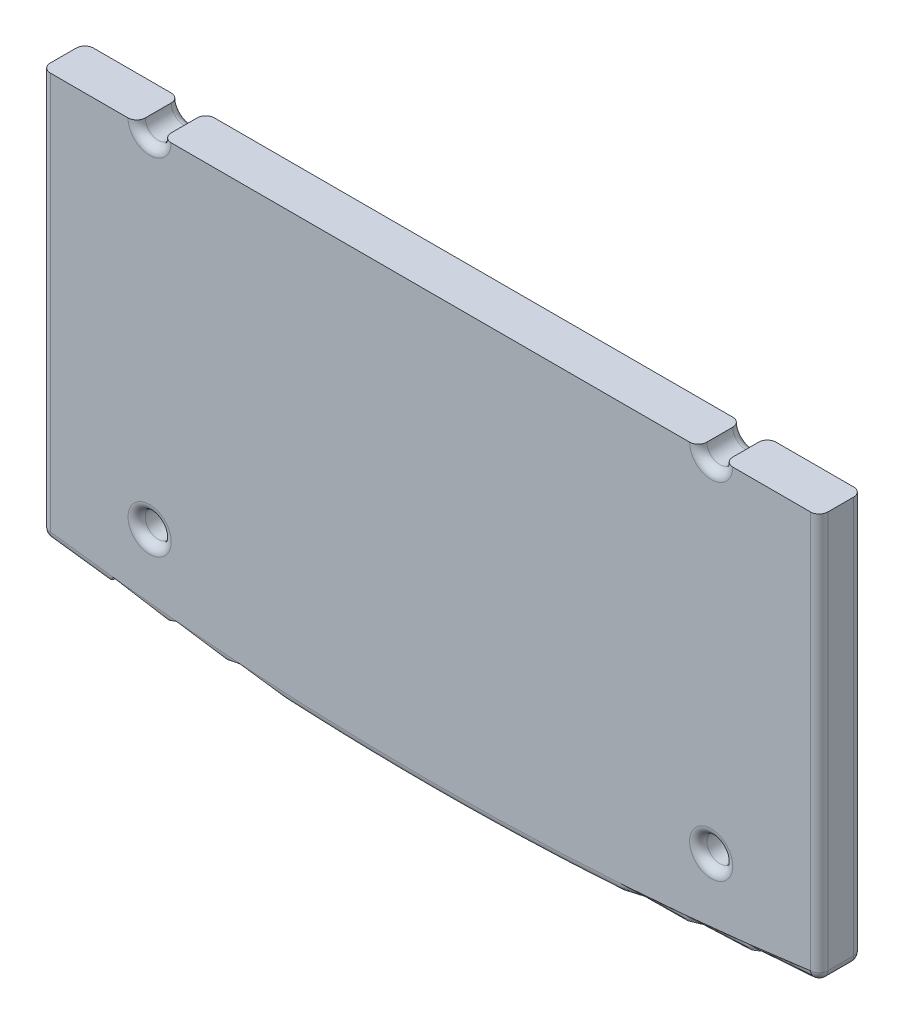
ISO-10303-21;
HEADER;
FILE_DESCRIPTION(('STEP AP214'),'2;1');
FILE_NAME('part.step','',(''),(''),'','','');
FILE_SCHEMA(('AUTOMOTIVE_DESIGN { 1 0 10303 214 1 1 1 1 }'));
ENDSEC;
DATA;
#1=APPLICATION_CONTEXT('core data for automotive mechanical design processes');
#2=APPLICATION_PROTOCOL_DEFINITION('international standard','automotive_design',2000,#1);
#3=PRODUCT_CONTEXT('',#1,'mechanical');
#4=PRODUCT('Part','Part','',(#3));
#5=PRODUCT_RELATED_PRODUCT_CATEGORY('part','',(#4));
#6=PRODUCT_DEFINITION_FORMATION('','',#4);
#7=PRODUCT_DEFINITION_CONTEXT('part definition',#1,'design');
#8=PRODUCT_DEFINITION('design','',#6,#7);
#9=PRODUCT_DEFINITION_SHAPE('','',#8);
#10=(LENGTH_UNIT() NAMED_UNIT(*) SI_UNIT(.MILLI.,.METRE.));
#11=(NAMED_UNIT(*) PLANE_ANGLE_UNIT() SI_UNIT($,.RADIAN.));
#12=(NAMED_UNIT(*) SI_UNIT($,.STERADIAN.) SOLID_ANGLE_UNIT());
#13=UNCERTAINTY_MEASURE_WITH_UNIT(LENGTH_MEASURE(1.E-05),#10,'distance_accuracy_value','');
#14=(GEOMETRIC_REPRESENTATION_CONTEXT(3) GLOBAL_UNCERTAINTY_ASSIGNED_CONTEXT((#13)) GLOBAL_UNIT_ASSIGNED_CONTEXT((#10,
#11,#12)) REPRESENTATION_CONTEXT('',''));
#15=CARTESIAN_POINT('',(0.,0.,0.));
#16=DIRECTION('',(0.,0.,1.));
#17=DIRECTION('',(1.,0.,0.));
#18=AXIS2_PLACEMENT_3D('',#15,#16,#17);
#19=CARTESIAN_POINT('',(65.,-80.,10.));
#20=DIRECTION('',(0.,0.,-1.));
#21=DIRECTION('',(-1.,0.,0.));
#22=AXIS2_PLACEMENT_3D('',#19,#20,#21);
#23=CYLINDRICAL_SURFACE('',#22,3.00000000000001);
#24=CARTESIAN_POINT('',(65.,-80.,8.));
#25=DIRECTION('',(0.,0.,1.));
#26=DIRECTION('',(1.,0.,0.));
#27=AXIS2_PLACEMENT_3D('',#24,#25,#26);
#28=CIRCLE('',#27,3.00000000000001);
#29=CARTESIAN_POINT('',(68.,-80.,8.));
#30=VERTEX_POINT('',#29);
#31=EDGE_CURVE('E288',#30,#30,#28,.T.);
#32=ORIENTED_EDGE('',*,*,#31,.T.);
#33=EDGE_LOOP('',(#32));
#34=FACE_BOUND('',#33,.T.);
#35=CARTESIAN_POINT('',(65.,-80.,2.));
#36=DIRECTION('',(0.,0.,1.));
#37=DIRECTION('',(1.,0.,0.));
#38=AXIS2_PLACEMENT_3D('',#35,#36,#37);
#39=CIRCLE('',#38,3.00000000000001);
#40=CARTESIAN_POINT('',(68.,-80.,2.));
#41=VERTEX_POINT('',#40);
#42=EDGE_CURVE('E284',#41,#41,#39,.F.);
#43=ORIENTED_EDGE('',*,*,#42,.T.);
#44=EDGE_LOOP('',(#43));
#45=FACE_BOUND('',#44,.T.);
#46=ADVANCED_FACE('F43',(#34,#45),#23,.F.);
#47=CARTESIAN_POINT('',(-65.,-80.,10.));
#48=DIRECTION('',(0.,0.,-1.));
#49=DIRECTION('',(-1.,0.,0.));
#50=AXIS2_PLACEMENT_3D('',#47,#48,#49);
#51=CYLINDRICAL_SURFACE('',#50,3.00000000000001);
#52=CARTESIAN_POINT('',(-65.,-80.,8.));
#53=DIRECTION('',(0.,0.,1.));
#54=DIRECTION('',(1.,0.,0.));
#55=AXIS2_PLACEMENT_3D('',#52,#53,#54);
#56=CIRCLE('',#55,3.00000000000001);
#57=CARTESIAN_POINT('',(-62.,-80.,8.));
#58=VERTEX_POINT('',#57);
#59=EDGE_CURVE('E318',#58,#58,#56,.T.);
#60=ORIENTED_EDGE('',*,*,#59,.T.);
#61=EDGE_LOOP('',(#60));
#62=FACE_BOUND('',#61,.T.);
#63=CARTESIAN_POINT('',(-65.,-80.,2.));
#64=DIRECTION('',(0.,0.,1.));
#65=DIRECTION('',(1.,0.,0.));
#66=AXIS2_PLACEMENT_3D('',#63,#64,#65);
#67=CIRCLE('',#66,3.00000000000001);
#68=CARTESIAN_POINT('',(-62.,-80.,2.));
#69=VERTEX_POINT('',#68);
#70=EDGE_CURVE('E315',#69,#69,#67,.F.);
#71=ORIENTED_EDGE('',*,*,#70,.T.);
#72=EDGE_LOOP('',(#71));
#73=FACE_BOUND('',#72,.T.);
#74=ADVANCED_FACE('F389',(#62,#73),#51,.F.);
#75=CARTESIAN_POINT('',(90.,0.,10.));
#76=DIRECTION('',(1.,0.,0.));
#77=DIRECTION('',(0.,1.,0.));
#78=AXIS2_PLACEMENT_3D('',#75,#76,#77);
#79=PLANE('',#78);
#80=DIRECTION('',(0.,0.,-1.));
#81=VECTOR('',#80,1.);
#82=CARTESIAN_POINT('',(90.,0.,10.));
#83=LINE('',#82,#81);
#84=CARTESIAN_POINT('',(90.,0.,8.));
#85=VERTEX_POINT('',#84);
#86=CARTESIAN_POINT('',(90.,0.,2.));
#87=VERTEX_POINT('',#86);
#88=EDGE_CURVE('E337',#85,#87,#83,.T.);
#89=ORIENTED_EDGE('',*,*,#88,.F.);
#90=DIRECTION('',(0.,-1.,0.));
#91=VECTOR('',#90,1.);
#92=CARTESIAN_POINT('',(90.,0.,8.));
#93=LINE('',#92,#91);
#94=CARTESIAN_POINT('',(90.,-91.9885850637983,8.));
#95=VERTEX_POINT('',#94);
#96=EDGE_CURVE('E253',#85,#95,#93,.T.);
#97=ORIENTED_EDGE('',*,*,#96,.T.);
#98=DIRECTION('',(0.,0.,-1.));
#99=VECTOR('',#98,1.);
#100=CARTESIAN_POINT('',(90.,-91.9885850637983,10.));
#101=LINE('',#100,#99);
#102=CARTESIAN_POINT('',(90.,-91.9885850637983,2.));
#103=VERTEX_POINT('',#102);
#104=EDGE_CURVE('E249',#95,#103,#101,.T.);
#105=ORIENTED_EDGE('',*,*,#104,.T.);
#106=DIRECTION('',(0.,-1.,0.));
#107=VECTOR('',#106,1.);
#108=CARTESIAN_POINT('',(90.,86.269555063544,2.));
#109=LINE('',#108,#107);
#110=EDGE_CURVE('E264',#103,#87,#109,.F.);
#111=ORIENTED_EDGE('',*,*,#110,.T.);
#112=EDGE_LOOP('',(#89,#97,#105,#111));
#113=FACE_BOUND('',#112,.T.);
#114=ADVANCED_FACE('F336',(#113),#79,.T.);
#115=CARTESIAN_POINT('',(-90.,0.,10.));
#116=DIRECTION('',(1.,0.,0.));
#117=DIRECTION('',(0.,1.,0.));
#118=AXIS2_PLACEMENT_3D('',#115,#116,#117);
#119=PLANE('',#118);
#120=DIRECTION('',(0.,-1.,0.));
#121=VECTOR('',#120,1.);
#122=CARTESIAN_POINT('',(-90.,86.2695550635439,8.));
#123=LINE('',#122,#121);
#124=CARTESIAN_POINT('',(-90.,-91.9885850637981,8.));
#125=VERTEX_POINT('',#124);
#126=CARTESIAN_POINT('',(-90.,0.,8.));
#127=VERTEX_POINT('',#126);
#128=EDGE_CURVE('E285',#125,#127,#123,.F.);
#129=ORIENTED_EDGE('',*,*,#128,.T.);
#130=DIRECTION('',(0.,0.,-1.));
#131=VECTOR('',#130,1.);
#132=CARTESIAN_POINT('',(-90.,0.,10.));
#133=LINE('',#132,#131);
#134=CARTESIAN_POINT('',(-90.,0.,2.));
#135=VERTEX_POINT('',#134);
#136=EDGE_CURVE('E186',#127,#135,#133,.T.);
#137=ORIENTED_EDGE('',*,*,#136,.T.);
#138=DIRECTION('',(0.,-1.,0.));
#139=VECTOR('',#138,1.);
#140=CARTESIAN_POINT('',(-90.,0.,2.));
#141=LINE('',#140,#139);
#142=CARTESIAN_POINT('',(-90.,-91.9885850637981,2.));
#143=VERTEX_POINT('',#142);
#144=EDGE_CURVE('E185',#135,#143,#141,.T.);
#145=ORIENTED_EDGE('',*,*,#144,.T.);
#146=DIRECTION('',(0.,0.,1.));
#147=VECTOR('',#146,1.);
#148=CARTESIAN_POINT('',(-90.,-91.9885850637981,10.));
#149=LINE('',#148,#147);
#150=EDGE_CURVE('E278',#143,#125,#149,.T.);
#151=ORIENTED_EDGE('',*,*,#150,.T.);
#152=EDGE_LOOP('',(#129,#137,#145,#151));
#153=FACE_BOUND('',#152,.T.);
#154=ADVANCED_FACE('F363',(#153),#119,.F.);
#155=CARTESIAN_POINT('',(0.,549.113632323209,10.));
#156=DIRECTION('',(0.,0.,-1.));
#157=DIRECTION('',(-1.,0.,0.));
#158=AXIS2_PLACEMENT_3D('',#155,#156,#157);
#159=CYLINDRICAL_SURFACE('',#158,649.113632323209);
#160=CARTESIAN_POINT('',(0.,549.113632323209,8.));
#161=DIRECTION('',(0.,0.,1.));
#162=DIRECTION('',(1.,0.,0.));
#163=AXIS2_PLACEMENT_3D('',#160,#161,#162);
#164=CIRCLE('',#163,649.113632323209);
#165=CARTESIAN_POINT('',(88.2719769623275,-93.9700059004614,8.));
#166=VERTEX_POINT('',#165);
#167=CARTESIAN_POINT('',(-88.2719769623275,-93.9700059004614,8.));
#168=VERTEX_POINT('',#167);
#169=EDGE_CURVE('E354',#166,#168,#164,.F.);
#170=ORIENTED_EDGE('',*,*,#169,.T.);
#171=DIRECTION('',(0.,0.,-1.));
#172=VECTOR('',#171,1.);
#173=CARTESIAN_POINT('',(-88.2719769623275,-93.9700059004616,10.));
#174=LINE('',#173,#172);
#175=CARTESIAN_POINT('',(-88.2719769623275,-93.9700059004614,2.));
#176=VERTEX_POINT('',#175);
#177=EDGE_CURVE('E357',#168,#176,#174,.T.);
#178=ORIENTED_EDGE('',*,*,#177,.T.);
#179=CARTESIAN_POINT('',(0.,549.113632323209,2.));
#180=DIRECTION('',(0.,0.,1.));
#181=DIRECTION('',(1.,0.,0.));
#182=AXIS2_PLACEMENT_3D('',#179,#180,#181);
#183=CIRCLE('',#182,649.113632323209);
#184=CARTESIAN_POINT('',(88.2719769623275,-93.9700059004614,2.));
#185=VERTEX_POINT('',#184);
#186=EDGE_CURVE('E235',#176,#185,#183,.T.);
#187=ORIENTED_EDGE('',*,*,#186,.T.);
#188=DIRECTION('',(0.,0.,-1.));
#189=VECTOR('',#188,1.);
#190=CARTESIAN_POINT('',(88.2719769623276,-93.9700059004616,10.));
#191=LINE('',#190,#189);
#192=EDGE_CURVE('E358',#185,#166,#191,.F.);
#193=ORIENTED_EDGE('',*,*,#192,.T.);
#194=EDGE_LOOP('',(#170,#178,#187,#193));
#195=FACE_BOUND('',#194,.T.);
#196=ADVANCED_FACE('F374',(#195),#159,.T.);
#197=CARTESIAN_POINT('',(0.,0.,10.));
#198=DIRECTION('',(0.,0.,1.));
#199=DIRECTION('',(1.,0.,0.));
#200=AXIS2_PLACEMENT_3D('',#197,#198,#199);
#201=PLANE('',#200);
#202=DIRECTION('',(1.,0.,0.));
#203=VECTOR('',#202,1.);
#204=CARTESIAN_POINT('',(-102.315032388531,0.,10.));
#205=LINE('',#204,#203);
#206=CARTESIAN_POINT('',(-88.,0.,10.));
#207=VERTEX_POINT('',#206);
#208=CARTESIAN_POINT('',(-70.,0.,10.));
#209=VERTEX_POINT('',#208);
#210=EDGE_CURVE('E477',#207,#209,#205,.T.);
#211=ORIENTED_EDGE('',*,*,#210,.F.);
#212=DIRECTION('',(0.,-1.,0.));
#213=VECTOR('',#212,1.);
#214=CARTESIAN_POINT('',(-88.,-93.7304449364561,10.));
#215=LINE('',#214,#213);
#216=CARTESIAN_POINT('',(-88.,-91.9885850637982,10.));
#217=VERTEX_POINT('',#216);
#218=EDGE_CURVE('E298',#207,#217,#215,.T.);
#219=ORIENTED_EDGE('',*,*,#218,.T.);
#220=CARTESIAN_POINT('',(0.,549.113632323209,10.));
#221=DIRECTION('',(0.,0.,1.));
#222=DIRECTION('',(1.,0.,0.));
#223=AXIS2_PLACEMENT_3D('',#220,#221,#222);
#224=CIRCLE('',#223,647.113632323209);
#225=CARTESIAN_POINT('',(88.,-91.9885850637982,10.));
#226=VERTEX_POINT('',#225);
#227=EDGE_CURVE('E300',#217,#226,#224,.T.);
#228=ORIENTED_EDGE('',*,*,#227,.T.);
#229=DIRECTION('',(0.,-1.,0.));
#230=VECTOR('',#229,1.);
#231=CARTESIAN_POINT('',(88.,0.,10.));
#232=LINE('',#231,#230);
#233=CARTESIAN_POINT('',(87.9999999999999,0.,10.));
#234=VERTEX_POINT('',#233);
#235=EDGE_CURVE('E295',#226,#234,#232,.F.);
#236=ORIENTED_EDGE('',*,*,#235,.T.);
#237=CARTESIAN_POINT('',(70.,0.,10.));
#238=VERTEX_POINT('',#237);
#239=EDGE_CURVE('E478',#238,#234,#205,.T.);
#240=ORIENTED_EDGE('',*,*,#239,.F.);
#241=CARTESIAN_POINT('',(65.,0.,10.));
#242=DIRECTION('',(0.,0.,1.));
#243=DIRECTION('',(1.,0.,0.));
#244=AXIS2_PLACEMENT_3D('',#241,#242,#243);
#245=CIRCLE('',#244,5.00000000000001);
#246=CARTESIAN_POINT('',(60.,0.,10.));
#247=VERTEX_POINT('',#246);
#248=EDGE_CURVE('E303',#238,#247,#245,.F.);
#249=ORIENTED_EDGE('',*,*,#248,.T.);
#250=CARTESIAN_POINT('',(-60.,0.,10.));
#251=VERTEX_POINT('',#250);
#252=EDGE_CURVE('E469',#251,#247,#205,.T.);
#253=ORIENTED_EDGE('',*,*,#252,.F.);
#254=CARTESIAN_POINT('',(-65.,0.,10.));
#255=DIRECTION('',(0.,0.,1.));
#256=DIRECTION('',(1.,0.,0.));
#257=AXIS2_PLACEMENT_3D('',#254,#255,#256);
#258=CIRCLE('',#257,5.00000000000001);
#259=EDGE_CURVE('E306',#251,#209,#258,.F.);
#260=ORIENTED_EDGE('',*,*,#259,.T.);
#261=EDGE_LOOP('',(#211,#219,#228,#236,#240,#249,#253,#260));
#262=FACE_BOUND('',#261,.T.);
#263=CARTESIAN_POINT('',(65.,-80.,10.));
#264=DIRECTION('',(0.,0.,1.));
#265=DIRECTION('',(1.,0.,0.));
#266=AXIS2_PLACEMENT_3D('',#263,#264,#265);
#267=CIRCLE('',#266,5.00000000000001);
#268=CARTESIAN_POINT('',(70.,-80.,10.));
#269=VERTEX_POINT('',#268);
#270=EDGE_CURVE('E312',#269,#269,#267,.F.);
#271=ORIENTED_EDGE('',*,*,#270,.T.);
#272=EDGE_LOOP('',(#271));
#273=FACE_BOUND('',#272,.T.);
#274=CARTESIAN_POINT('',(-65.,-80.,10.));
#275=DIRECTION('',(0.,0.,1.));
#276=DIRECTION('',(1.,0.,0.));
#277=AXIS2_PLACEMENT_3D('',#274,#275,#276);
#278=CIRCLE('',#277,5.00000000000001);
#279=CARTESIAN_POINT('',(-60.,-80.,10.));
#280=VERTEX_POINT('',#279);
#281=EDGE_CURVE('E309',#280,#280,#278,.F.);
#282=ORIENTED_EDGE('',*,*,#281,.T.);
#283=EDGE_LOOP('',(#282));
#284=FACE_BOUND('',#283,.T.);
#285=ADVANCED_FACE('F376',(#262,#273,#284),#201,.T.);
#286=CARTESIAN_POINT('',(0.,0.,0.));
#287=DIRECTION('',(0.,0.,1.));
#288=DIRECTION('',(1.,0.,0.));
#289=AXIS2_PLACEMENT_3D('',#286,#287,#288);
#290=PLANE('',#289);
#291=CARTESIAN_POINT('',(65.,-80.,0.));
#292=DIRECTION('',(0.,0.,1.));
#293=DIRECTION('',(1.,0.,0.));
#294=AXIS2_PLACEMENT_3D('',#291,#292,#293);
#295=CIRCLE('',#294,5.00000000000001);
#296=CARTESIAN_POINT('',(70.,-80.,0.));
#297=VERTEX_POINT('',#296);
#298=EDGE_CURVE('E195',#297,#297,#295,.T.);
#299=ORIENTED_EDGE('',*,*,#298,.T.);
#300=EDGE_LOOP('',(#299));
#301=FACE_BOUND('',#300,.T.);
#302=CARTESIAN_POINT('',(-65.,-80.,0.));
#303=DIRECTION('',(0.,0.,1.));
#304=DIRECTION('',(1.,0.,0.));
#305=AXIS2_PLACEMENT_3D('',#302,#303,#304);
#306=CIRCLE('',#305,5.00000000000001);
#307=CARTESIAN_POINT('',(-60.,-80.,0.));
#308=VERTEX_POINT('',#307);
#309=EDGE_CURVE('E192',#308,#308,#306,.T.);
#310=ORIENTED_EDGE('',*,*,#309,.T.);
#311=EDGE_LOOP('',(#310));
#312=FACE_BOUND('',#311,.T.);
#313=DIRECTION('',(0.,-1.,0.));
#314=VECTOR('',#313,1.);
#315=CARTESIAN_POINT('',(-88.,0.,0.));
#316=LINE('',#315,#314);
#317=CARTESIAN_POINT('',(-88.,-91.9885850637982,0.));
#318=VERTEX_POINT('',#317);
#319=CARTESIAN_POINT('',(-88.,0.,0.));
#320=VERTEX_POINT('',#319);
#321=EDGE_CURVE('E183',#318,#320,#316,.F.);
#322=ORIENTED_EDGE('',*,*,#321,.T.);
#323=DIRECTION('',(1.,0.,0.));
#324=VECTOR('',#323,1.);
#325=CARTESIAN_POINT('',(-102.315032388531,0.,0.));
#326=LINE('',#325,#324);
#327=CARTESIAN_POINT('',(-70.,0.,0.));
#328=VERTEX_POINT('',#327);
#329=EDGE_CURVE('E165',#320,#328,#326,.T.);
#330=ORIENTED_EDGE('',*,*,#329,.T.);
#331=CARTESIAN_POINT('',(-65.,0.,0.));
#332=DIRECTION('',(0.,0.,1.));
#333=DIRECTION('',(1.,0.,0.));
#334=AXIS2_PLACEMENT_3D('',#331,#332,#333);
#335=CIRCLE('',#334,5.00000000000001);
#336=CARTESIAN_POINT('',(-60.,0.,0.));
#337=VERTEX_POINT('',#336);
#338=EDGE_CURVE('E248',#328,#337,#335,.T.);
#339=ORIENTED_EDGE('',*,*,#338,.T.);
#340=CARTESIAN_POINT('',(60.,0.,0.));
#341=VERTEX_POINT('',#340);
#342=EDGE_CURVE('E176',#337,#341,#326,.T.);
#343=ORIENTED_EDGE('',*,*,#342,.T.);
#344=CARTESIAN_POINT('',(65.,0.,0.));
#345=DIRECTION('',(0.,0.,1.));
#346=DIRECTION('',(1.,0.,0.));
#347=AXIS2_PLACEMENT_3D('',#344,#345,#346);
#348=CIRCLE('',#347,5.00000000000001);
#349=CARTESIAN_POINT('',(70.,0.,0.));
#350=VERTEX_POINT('',#349);
#351=EDGE_CURVE('E247',#341,#350,#348,.T.);
#352=ORIENTED_EDGE('',*,*,#351,.T.);
#353=CARTESIAN_POINT('',(87.9999999999999,0.,0.));
#354=VERTEX_POINT('',#353);
#355=EDGE_CURVE('E65',#350,#354,#326,.T.);
#356=ORIENTED_EDGE('',*,*,#355,.T.);
#357=DIRECTION('',(0.,-1.,0.));
#358=VECTOR('',#357,1.);
#359=CARTESIAN_POINT('',(88.,-93.730444936456,0.));
#360=LINE('',#359,#358);
#361=CARTESIAN_POINT('',(88.,-91.9885850637982,0.));
#362=VERTEX_POINT('',#361);
#363=EDGE_CURVE('E197',#354,#362,#360,.T.);
#364=ORIENTED_EDGE('',*,*,#363,.T.);
#365=CARTESIAN_POINT('',(0.,549.113632323209,0.));
#366=DIRECTION('',(0.,0.,1.));
#367=DIRECTION('',(1.,0.,0.));
#368=AXIS2_PLACEMENT_3D('',#365,#366,#367);
#369=CIRCLE('',#368,647.113632323209);
#370=EDGE_CURVE('E191',#362,#318,#369,.F.);
#371=ORIENTED_EDGE('',*,*,#370,.T.);
#372=EDGE_LOOP('',(#322,#330,#339,#343,#352,#356,#364,#371));
#373=FACE_BOUND('',#372,.T.);
#374=ADVANCED_FACE('F189',(#301,#312,#373),#290,.F.);
#375=CARTESIAN_POINT('',(-65.,0.,10.));
#376=DIRECTION('',(0.,0.,-1.));
#377=DIRECTION('',(-1.,0.,0.));
#378=AXIS2_PLACEMENT_3D('',#375,#376,#377);
#379=CYLINDRICAL_SURFACE('',#378,3.00000000000001);
#380=DIRECTION('',(0.,0.,-1.));
#381=VECTOR('',#380,1.);
#382=CARTESIAN_POINT('',(-68.,0.,10.));
#383=LINE('',#382,#381);
#384=CARTESIAN_POINT('',(-68.,0.,8.));
#385=VERTEX_POINT('',#384);
#386=CARTESIAN_POINT('',(-68.,0.,2.));
#387=VERTEX_POINT('',#386);
#388=EDGE_CURVE('E58',#385,#387,#383,.T.);
#389=ORIENTED_EDGE('',*,*,#388,.F.);
#390=CARTESIAN_POINT('',(-65.,0.,8.));
#391=DIRECTION('',(0.,0.,1.));
#392=DIRECTION('',(1.,0.,0.));
#393=AXIS2_PLACEMENT_3D('',#390,#391,#392);
#394=CIRCLE('',#393,3.00000000000001);
#395=CARTESIAN_POINT('',(-62.,0.,8.));
#396=VERTEX_POINT('',#395);
#397=EDGE_CURVE('E324',#385,#396,#394,.T.);
#398=ORIENTED_EDGE('',*,*,#397,.T.);
#399=DIRECTION('',(0.,0.,-1.));
#400=VECTOR('',#399,1.);
#401=CARTESIAN_POINT('',(-62.,0.,10.));
#402=LINE('',#401,#400);
#403=CARTESIAN_POINT('',(-62.,0.,2.));
#404=VERTEX_POINT('',#403);
#405=EDGE_CURVE('E461',#404,#396,#402,.F.);
#406=ORIENTED_EDGE('',*,*,#405,.F.);
#407=CARTESIAN_POINT('',(-65.,0.,2.));
#408=DIRECTION('',(0.,0.,1.));
#409=DIRECTION('',(1.,0.,0.));
#410=AXIS2_PLACEMENT_3D('',#407,#408,#409);
#411=CIRCLE('',#410,3.00000000000001);
#412=EDGE_CURVE('E321',#404,#387,#411,.F.);
#413=ORIENTED_EDGE('',*,*,#412,.T.);
#414=EDGE_LOOP('',(#389,#398,#406,#413));
#415=FACE_BOUND('',#414,.T.);
#416=ADVANCED_FACE('F482',(#415),#379,.F.);
#417=CARTESIAN_POINT('',(65.,0.,10.));
#418=DIRECTION('',(0.,0.,-1.));
#419=DIRECTION('',(-1.,0.,0.));
#420=AXIS2_PLACEMENT_3D('',#417,#418,#419);
#421=CYLINDRICAL_SURFACE('',#420,3.00000000000001);
#422=DIRECTION('',(0.,0.,-1.));
#423=VECTOR('',#422,1.);
#424=CARTESIAN_POINT('',(62.,0.,10.));
#425=LINE('',#424,#423);
#426=CARTESIAN_POINT('',(62.,0.,8.));
#427=VERTEX_POINT('',#426);
#428=CARTESIAN_POINT('',(62.,0.,2.));
#429=VERTEX_POINT('',#428);
#430=EDGE_CURVE('E175',#427,#429,#425,.T.);
#431=ORIENTED_EDGE('',*,*,#430,.F.);
#432=CARTESIAN_POINT('',(65.,0.,8.));
#433=DIRECTION('',(0.,0.,1.));
#434=DIRECTION('',(1.,0.,0.));
#435=AXIS2_PLACEMENT_3D('',#432,#433,#434);
#436=CIRCLE('',#435,3.00000000000001);
#437=CARTESIAN_POINT('',(68.,0.,8.));
#438=VERTEX_POINT('',#437);
#439=EDGE_CURVE('E329',#427,#438,#436,.T.);
#440=ORIENTED_EDGE('',*,*,#439,.T.);
#441=DIRECTION('',(0.,0.,-1.));
#442=VECTOR('',#441,1.);
#443=CARTESIAN_POINT('',(68.,0.,10.));
#444=LINE('',#443,#442);
#445=CARTESIAN_POINT('',(68.,0.,2.));
#446=VERTEX_POINT('',#445);
#447=EDGE_CURVE('E487',#446,#438,#444,.F.);
#448=ORIENTED_EDGE('',*,*,#447,.F.);
#449=CARTESIAN_POINT('',(65.,0.,2.));
#450=DIRECTION('',(0.,0.,1.));
#451=DIRECTION('',(1.,0.,0.));
#452=AXIS2_PLACEMENT_3D('',#449,#450,#451);
#453=CIRCLE('',#452,3.00000000000001);
#454=EDGE_CURVE('E327',#446,#429,#453,.F.);
#455=ORIENTED_EDGE('',*,*,#454,.T.);
#456=EDGE_LOOP('',(#431,#440,#448,#455));
#457=FACE_BOUND('',#456,.T.);
#458=ADVANCED_FACE('F429',(#457),#421,.F.);
#459=CARTESIAN_POINT('',(88.,0.,8.));
#460=DIRECTION('',(0.,-1.,0.));
#461=DIRECTION('',(1.,0.,0.));
#462=AXIS2_PLACEMENT_3D('',#459,#460,#461);
#463=CYLINDRICAL_SURFACE('',#462,2.);
#464=CARTESIAN_POINT('',(88.,0.,8.));
#465=DIRECTION('',(0.,-1.,0.));
#466=DIRECTION('',(0.,0.,-1.));
#467=AXIS2_PLACEMENT_3D('',#464,#465,#466);
#468=CIRCLE('',#467,2.);
#469=EDGE_CURVE('E206',#234,#85,#468,.F.);
#470=ORIENTED_EDGE('',*,*,#469,.F.);
#471=ORIENTED_EDGE('',*,*,#235,.F.);
#472=CARTESIAN_POINT('',(88.,-91.9885850637983,8.));
#473=DIRECTION('',(0.,-1.,0.));
#474=DIRECTION('',(0.,0.,-1.));
#475=AXIS2_PLACEMENT_3D('',#472,#473,#474);
#476=CIRCLE('',#475,2.);
#477=EDGE_CURVE('E233',#95,#226,#476,.T.);
#478=ORIENTED_EDGE('',*,*,#477,.F.);
#479=ORIENTED_EDGE('',*,*,#96,.F.);
#480=EDGE_LOOP('',(#470,#471,#478,#479));
#481=FACE_BOUND('',#480,.T.);
#482=ADVANCED_FACE('F347',(#481),#463,.T.);
#483=CARTESIAN_POINT('',(88.,-91.9885850637983,10.));
#484=DIRECTION('',(0.,0.,-1.));
#485=DIRECTION('',(-1.,0.,0.));
#486=AXIS2_PLACEMENT_3D('',#483,#484,#485);
#487=CYLINDRICAL_SURFACE('',#486,2.);
#488=CARTESIAN_POINT('',(88.,-91.9885850637983,2.));
#489=DIRECTION('',(0.,0.,-1.));
#490=DIRECTION('',(-1.,0.,0.));
#491=AXIS2_PLACEMENT_3D('',#488,#489,#490);
#492=CIRCLE('',#491,2.);
#493=EDGE_CURVE('E227',#103,#185,#492,.T.);
#494=ORIENTED_EDGE('',*,*,#493,.F.);
#495=ORIENTED_EDGE('',*,*,#104,.F.);
#496=CARTESIAN_POINT('',(88.,-91.9885850637982,8.));
#497=DIRECTION('',(0.,0.,1.));
#498=DIRECTION('',(1.,0.,0.));
#499=AXIS2_PLACEMENT_3D('',#496,#497,#498);
#500=CIRCLE('',#499,2.);
#501=EDGE_CURVE('E230',#166,#95,#500,.T.);
#502=ORIENTED_EDGE('',*,*,#501,.F.);
#503=ORIENTED_EDGE('',*,*,#192,.F.);
#504=EDGE_LOOP('',(#494,#495,#502,#503));
#505=FACE_BOUND('',#504,.T.);
#506=ADVANCED_FACE('F343',(#505),#487,.T.);
#507=CARTESIAN_POINT('',(88.,0.,2.));
#508=DIRECTION('',(0.,1.,0.));
#509=DIRECTION('',(-1.,0.,0.));
#510=AXIS2_PLACEMENT_3D('',#507,#508,#509);
#511=CYLINDRICAL_SURFACE('',#510,2.);
#512=CARTESIAN_POINT('',(88.,0.,2.));
#513=DIRECTION('',(0.,-1.,0.));
#514=DIRECTION('',(0.,0.,-1.));
#515=AXIS2_PLACEMENT_3D('',#512,#513,#514);
#516=CIRCLE('',#515,2.);
#517=EDGE_CURVE('E368',#87,#354,#516,.F.);
#518=ORIENTED_EDGE('',*,*,#517,.F.);
#519=ORIENTED_EDGE('',*,*,#110,.F.);
#520=CARTESIAN_POINT('',(88.,-91.9885850637982,2.));
#521=DIRECTION('',(0.,-1.,0.));
#522=DIRECTION('',(1.,0.,0.));
#523=AXIS2_PLACEMENT_3D('',#520,#521,#522);
#524=CIRCLE('',#523,2.);
#525=EDGE_CURVE('E225',#362,#103,#524,.T.);
#526=ORIENTED_EDGE('',*,*,#525,.F.);
#527=ORIENTED_EDGE('',*,*,#363,.F.);
#528=EDGE_LOOP('',(#518,#519,#526,#527));
#529=FACE_BOUND('',#528,.T.);
#530=ADVANCED_FACE('F262',(#529),#511,.T.);
#531=CARTESIAN_POINT('',(88.,-91.9885850637981,8.));
#532=DIRECTION('',(0.,0.,1.));
#533=DIRECTION('',(1.,0.,0.));
#534=AXIS2_PLACEMENT_3D('',#531,#532,#533);
#535=SPHERICAL_SURFACE('',#534,2.);
#536=ORIENTED_EDGE('',*,*,#501,.T.);
#537=ORIENTED_EDGE('',*,*,#477,.T.);
#538=CARTESIAN_POINT('',(88.,-91.9885850637982,8.));
#539=DIRECTION('',(0.9907104183316,0.13598848116376,0.));
#540=DIRECTION('',(-0.13598848116376,0.9907104183316,0.));
#541=AXIS2_PLACEMENT_3D('',#538,#539,#540);
#542=CIRCLE('',#541,2.);
#543=EDGE_CURVE('E223',#166,#226,#542,.F.);
#544=ORIENTED_EDGE('',*,*,#543,.F.);
#545=EDGE_LOOP('',(#536,#537,#544));
#546=FACE_BOUND('',#545,.T.);
#547=ADVANCED_FACE('F349',(#546),#535,.T.);
#548=CARTESIAN_POINT('',(88.,-91.9885850637981,2.));
#549=DIRECTION('',(0.,0.,1.));
#550=DIRECTION('',(1.,0.,0.));
#551=AXIS2_PLACEMENT_3D('',#548,#549,#550);
#552=SPHERICAL_SURFACE('',#551,2.);
#553=ORIENTED_EDGE('',*,*,#525,.T.);
#554=ORIENTED_EDGE('',*,*,#493,.T.);
#555=CARTESIAN_POINT('',(88.,-91.9885850637982,2.));
#556=DIRECTION('',(0.990710418331599,0.135988481163765,0.));
#557=DIRECTION('',(-0.135988481163765,0.990710418331599,0.));
#558=AXIS2_PLACEMENT_3D('',#555,#556,#557);
#559=CIRCLE('',#558,2.);
#560=EDGE_CURVE('E220',#362,#185,#559,.F.);
#561=ORIENTED_EDGE('',*,*,#560,.F.);
#562=EDGE_LOOP('',(#553,#554,#561));
#563=FACE_BOUND('',#562,.T.);
#564=ADVANCED_FACE('F267',(#563),#552,.T.);
#565=CARTESIAN_POINT('',(-88.,0.,8.));
#566=DIRECTION('',(0.,1.,0.));
#567=DIRECTION('',(-1.,0.,0.));
#568=AXIS2_PLACEMENT_3D('',#565,#566,#567);
#569=CYLINDRICAL_SURFACE('',#568,2.);
#570=CARTESIAN_POINT('',(-88.,0.,8.));
#571=DIRECTION('',(0.,-1.,0.));
#572=DIRECTION('',(0.,0.,-1.));
#573=AXIS2_PLACEMENT_3D('',#570,#571,#572);
#574=CIRCLE('',#573,2.);
#575=EDGE_CURVE('E366',#127,#207,#574,.F.);
#576=ORIENTED_EDGE('',*,*,#575,.F.);
#577=ORIENTED_EDGE('',*,*,#128,.F.);
#578=CARTESIAN_POINT('',(-88.,-91.9885850637982,8.));
#579=DIRECTION('',(0.,-1.,0.));
#580=DIRECTION('',(1.,0.,0.));
#581=AXIS2_PLACEMENT_3D('',#578,#579,#580);
#582=CIRCLE('',#581,2.);
#583=EDGE_CURVE('E217',#217,#125,#582,.T.);
#584=ORIENTED_EDGE('',*,*,#583,.F.);
#585=ORIENTED_EDGE('',*,*,#218,.F.);
#586=EDGE_LOOP('',(#576,#577,#584,#585));
#587=FACE_BOUND('',#586,.T.);
#588=ADVANCED_FACE('F415',(#587),#569,.T.);
#589=CARTESIAN_POINT('',(0.,549.113632323209,8.));
#590=DIRECTION('',(0.,0.,1.));
#591=DIRECTION('',(1.,0.,0.));
#592=AXIS2_PLACEMENT_3D('',#589,#590,#591);
#593=TOROIDAL_SURFACE('',#592,647.113632323209,2.);
#594=ORIENTED_EDGE('',*,*,#543,.T.);
#595=ORIENTED_EDGE('',*,*,#227,.F.);
#596=CARTESIAN_POINT('',(-87.9999999999999,-91.9885850637982,8.));
#597=DIRECTION('',(-0.990710418331599,0.135988481163765,0.));
#598=DIRECTION('',(-0.135988481163765,-0.990710418331599,0.));
#599=AXIS2_PLACEMENT_3D('',#596,#597,#598);
#600=CIRCLE('',#599,2.);
#601=EDGE_CURVE('E214',#168,#217,#600,.T.);
#602=ORIENTED_EDGE('',*,*,#601,.F.);
#603=ORIENTED_EDGE('',*,*,#169,.F.);
#604=EDGE_LOOP('',(#594,#595,#602,#603));
#605=FACE_BOUND('',#604,.T.);
#606=ADVANCED_FACE('F355',(#605),#593,.T.);
#607=CARTESIAN_POINT('',(0.,549.113632323209,2.));
#608=DIRECTION('',(0.,0.,1.));
#609=DIRECTION('',(1.,0.,0.));
#610=AXIS2_PLACEMENT_3D('',#607,#608,#609);
#611=TOROIDAL_SURFACE('',#610,647.113632323209,2.);
#612=ORIENTED_EDGE('',*,*,#560,.T.);
#613=ORIENTED_EDGE('',*,*,#186,.F.);
#614=CARTESIAN_POINT('',(-88.,-91.9885850637982,2.));
#615=DIRECTION('',(-0.990710418331601,0.135988481163754,0.));
#616=DIRECTION('',(-0.135988481163754,-0.990710418331601,0.));
#617=AXIS2_PLACEMENT_3D('',#614,#615,#616);
#618=CIRCLE('',#617,2.);
#619=EDGE_CURVE('E211',#318,#176,#618,.T.);
#620=ORIENTED_EDGE('',*,*,#619,.F.);
#621=ORIENTED_EDGE('',*,*,#370,.F.);
#622=EDGE_LOOP('',(#612,#613,#620,#621));
#623=FACE_BOUND('',#622,.T.);
#624=ADVANCED_FACE('F270',(#623),#611,.T.);
#625=CARTESIAN_POINT('',(-88.,0.,2.));
#626=DIRECTION('',(0.,-1.,0.));
#627=DIRECTION('',(1.,0.,0.));
#628=AXIS2_PLACEMENT_3D('',#625,#626,#627);
#629=CYLINDRICAL_SURFACE('',#628,2.);
#630=CARTESIAN_POINT('',(-88.,0.,2.));
#631=DIRECTION('',(0.,-1.,0.));
#632=DIRECTION('',(0.,0.,-1.));
#633=AXIS2_PLACEMENT_3D('',#630,#631,#632);
#634=CIRCLE('',#633,2.);
#635=EDGE_CURVE('E168',#320,#135,#634,.F.);
#636=ORIENTED_EDGE('',*,*,#635,.F.);
#637=ORIENTED_EDGE('',*,*,#321,.F.);
#638=CARTESIAN_POINT('',(-88.,-91.9885850637981,2.));
#639=DIRECTION('',(0.,-1.,0.));
#640=DIRECTION('',(0.,0.,-1.));
#641=AXIS2_PLACEMENT_3D('',#638,#639,#640);
#642=CIRCLE('',#641,2.);
#643=EDGE_CURVE('E208',#143,#318,#642,.T.);
#644=ORIENTED_EDGE('',*,*,#643,.F.);
#645=ORIENTED_EDGE('',*,*,#144,.F.);
#646=EDGE_LOOP('',(#636,#637,#644,#645));
#647=FACE_BOUND('',#646,.T.);
#648=ADVANCED_FACE('F181',(#647),#629,.T.);
#649=CARTESIAN_POINT('',(-88.,-91.9885850637983,8.));
#650=DIRECTION('',(0.,0.,1.));
#651=DIRECTION('',(1.,0.,0.));
#652=AXIS2_PLACEMENT_3D('',#649,#650,#651);
#653=SPHERICAL_SURFACE('',#652,2.);
#654=ORIENTED_EDGE('',*,*,#601,.T.);
#655=ORIENTED_EDGE('',*,*,#583,.T.);
#656=CARTESIAN_POINT('',(-88.,-91.9885850637981,8.));
#657=DIRECTION('',(0.,0.,1.));
#658=DIRECTION('',(1.,0.,0.));
#659=AXIS2_PLACEMENT_3D('',#656,#657,#658);
#660=CIRCLE('',#659,2.);
#661=EDGE_CURVE('E205',#168,#125,#660,.F.);
#662=ORIENTED_EDGE('',*,*,#661,.F.);
#663=EDGE_LOOP('',(#654,#655,#662));
#664=FACE_BOUND('',#663,.T.);
#665=ADVANCED_FACE('F405',(#664),#653,.T.);
#666=CARTESIAN_POINT('',(-88.,-91.9885850637983,2.));
#667=DIRECTION('',(0.,0.,1.));
#668=DIRECTION('',(1.,0.,0.));
#669=AXIS2_PLACEMENT_3D('',#666,#667,#668);
#670=SPHERICAL_SURFACE('',#669,2.);
#671=ORIENTED_EDGE('',*,*,#643,.T.);
#672=ORIENTED_EDGE('',*,*,#619,.T.);
#673=CARTESIAN_POINT('',(-87.9999999999999,-91.9885850637982,2.));
#674=DIRECTION('',(0.,0.,-1.));
#675=DIRECTION('',(-1.,0.,0.));
#676=AXIS2_PLACEMENT_3D('',#673,#674,#675);
#677=CIRCLE('',#676,2.);
#678=EDGE_CURVE('E203',#143,#176,#677,.F.);
#679=ORIENTED_EDGE('',*,*,#678,.F.);
#680=EDGE_LOOP('',(#671,#672,#679));
#681=FACE_BOUND('',#680,.T.);
#682=ADVANCED_FACE('F274',(#681),#670,.T.);
#683=CARTESIAN_POINT('',(-87.9999999999999,-91.9885850637981,10.));
#684=DIRECTION('',(0.,0.,-1.));
#685=DIRECTION('',(-1.,0.,0.));
#686=AXIS2_PLACEMENT_3D('',#683,#684,#685);
#687=CYLINDRICAL_SURFACE('',#686,2.);
#688=ORIENTED_EDGE('',*,*,#661,.T.);
#689=ORIENTED_EDGE('',*,*,#150,.F.);
#690=ORIENTED_EDGE('',*,*,#678,.T.);
#691=ORIENTED_EDGE('',*,*,#177,.F.);
#692=EDGE_LOOP('',(#688,#689,#690,#691));
#693=FACE_BOUND('',#692,.T.);
#694=ADVANCED_FACE('F279',(#693),#687,.T.);
#695=CARTESIAN_POINT('',(65.,-80.,8.));
#696=DIRECTION('',(0.,0.,1.));
#697=DIRECTION('',(1.,0.,0.));
#698=AXIS2_PLACEMENT_3D('',#695,#696,#697);
#699=TOROIDAL_SURFACE('',#698,5.00000000000001,2.);
#700=ORIENTED_EDGE('',*,*,#270,.F.);
#701=EDGE_LOOP('',(#700));
#702=FACE_BOUND('',#701,.T.);
#703=ORIENTED_EDGE('',*,*,#31,.F.);
#704=EDGE_LOOP('',(#703));
#705=FACE_BOUND('',#704,.T.);
#706=ADVANCED_FACE('F402',(#702,#705),#699,.T.);
#707=CARTESIAN_POINT('',(-65.,-80.,8.));
#708=DIRECTION('',(0.,0.,1.));
#709=DIRECTION('',(1.,0.,0.));
#710=AXIS2_PLACEMENT_3D('',#707,#708,#709);
#711=TOROIDAL_SURFACE('',#710,5.00000000000001,2.);
#712=ORIENTED_EDGE('',*,*,#281,.F.);
#713=EDGE_LOOP('',(#712));
#714=FACE_BOUND('',#713,.T.);
#715=ORIENTED_EDGE('',*,*,#59,.F.);
#716=EDGE_LOOP('',(#715));
#717=FACE_BOUND('',#716,.T.);
#718=ADVANCED_FACE('F432',(#714,#717),#711,.T.);
#719=CARTESIAN_POINT('',(-65.,0.,8.));
#720=DIRECTION('',(0.,0.,1.));
#721=DIRECTION('',(1.,0.,0.));
#722=AXIS2_PLACEMENT_3D('',#719,#720,#721);
#723=TOROIDAL_SURFACE('',#722,5.00000000000001,2.);
#724=CARTESIAN_POINT('',(-60.,0.,8.));
#725=DIRECTION('',(0.,-1.,0.));
#726=DIRECTION('',(0.,0.,-1.));
#727=AXIS2_PLACEMENT_3D('',#724,#725,#726);
#728=CIRCLE('',#727,2.);
#729=EDGE_CURVE('E187',#396,#251,#728,.F.);
#730=ORIENTED_EDGE('',*,*,#729,.F.);
#731=ORIENTED_EDGE('',*,*,#397,.F.);
#732=CARTESIAN_POINT('',(-70.,0.,8.));
#733=DIRECTION('',(0.,-1.,0.));
#734=DIRECTION('',(0.,0.,-1.));
#735=AXIS2_PLACEMENT_3D('',#732,#733,#734);
#736=CIRCLE('',#735,2.);
#737=EDGE_CURVE('E462',#209,#385,#736,.F.);
#738=ORIENTED_EDGE('',*,*,#737,.F.);
#739=ORIENTED_EDGE('',*,*,#259,.F.);
#740=EDGE_LOOP('',(#730,#731,#738,#739));
#741=FACE_BOUND('',#740,.T.);
#742=ADVANCED_FACE('F436',(#741),#723,.T.);
#743=CARTESIAN_POINT('',(65.,0.,8.));
#744=DIRECTION('',(0.,0.,1.));
#745=DIRECTION('',(1.,0.,0.));
#746=AXIS2_PLACEMENT_3D('',#743,#744,#745);
#747=TOROIDAL_SURFACE('',#746,5.00000000000001,2.);
#748=CARTESIAN_POINT('',(70.,0.,8.));
#749=DIRECTION('',(0.,-1.,0.));
#750=DIRECTION('',(0.,0.,-1.));
#751=AXIS2_PLACEMENT_3D('',#748,#749,#750);
#752=CIRCLE('',#751,2.);
#753=EDGE_CURVE('E483',#438,#238,#752,.F.);
#754=ORIENTED_EDGE('',*,*,#753,.F.);
#755=ORIENTED_EDGE('',*,*,#439,.F.);
#756=CARTESIAN_POINT('',(60.,0.,8.));
#757=DIRECTION('',(0.,-1.,0.));
#758=DIRECTION('',(0.,0.,-1.));
#759=AXIS2_PLACEMENT_3D('',#756,#757,#758);
#760=CIRCLE('',#759,2.);
#761=EDGE_CURVE('E489',#247,#427,#760,.F.);
#762=ORIENTED_EDGE('',*,*,#761,.F.);
#763=ORIENTED_EDGE('',*,*,#248,.F.);
#764=EDGE_LOOP('',(#754,#755,#762,#763));
#765=FACE_BOUND('',#764,.T.);
#766=ADVANCED_FACE('F440',(#765),#747,.T.);
#767=CARTESIAN_POINT('',(65.,-80.,2.));
#768=DIRECTION('',(0.,0.,1.));
#769=DIRECTION('',(1.,0.,0.));
#770=AXIS2_PLACEMENT_3D('',#767,#768,#769);
#771=TOROIDAL_SURFACE('',#770,5.00000000000001,2.);
#772=ORIENTED_EDGE('',*,*,#42,.F.);
#773=EDGE_LOOP('',(#772));
#774=FACE_BOUND('',#773,.T.);
#775=ORIENTED_EDGE('',*,*,#298,.F.);
#776=EDGE_LOOP('',(#775));
#777=FACE_BOUND('',#776,.T.);
#778=ADVANCED_FACE('F444',(#774,#777),#771,.T.);
#779=CARTESIAN_POINT('',(-65.,-80.,2.));
#780=DIRECTION('',(0.,0.,1.));
#781=DIRECTION('',(1.,0.,0.));
#782=AXIS2_PLACEMENT_3D('',#779,#780,#781);
#783=TOROIDAL_SURFACE('',#782,5.00000000000001,2.);
#784=ORIENTED_EDGE('',*,*,#70,.F.);
#785=EDGE_LOOP('',(#784));
#786=FACE_BOUND('',#785,.T.);
#787=ORIENTED_EDGE('',*,*,#309,.F.);
#788=EDGE_LOOP('',(#787));
#789=FACE_BOUND('',#788,.T.);
#790=ADVANCED_FACE('F448',(#786,#789),#783,.T.);
#791=CARTESIAN_POINT('',(-65.,0.,2.));
#792=DIRECTION('',(0.,0.,1.));
#793=DIRECTION('',(1.,0.,0.));
#794=AXIS2_PLACEMENT_3D('',#791,#792,#793);
#795=TOROIDAL_SURFACE('',#794,5.00000000000001,2.);
#796=CARTESIAN_POINT('',(-60.,0.,2.));
#797=DIRECTION('',(0.,-1.,0.));
#798=DIRECTION('',(0.,0.,-1.));
#799=AXIS2_PLACEMENT_3D('',#796,#797,#798);
#800=CIRCLE('',#799,2.);
#801=EDGE_CURVE('E459',#337,#404,#800,.F.);
#802=ORIENTED_EDGE('',*,*,#801,.F.);
#803=ORIENTED_EDGE('',*,*,#338,.F.);
#804=CARTESIAN_POINT('',(-70.,0.,2.));
#805=DIRECTION('',(0.,-1.,0.));
#806=DIRECTION('',(0.,0.,-1.));
#807=AXIS2_PLACEMENT_3D('',#804,#805,#806);
#808=CIRCLE('',#807,2.);
#809=EDGE_CURVE('E170',#387,#328,#808,.F.);
#810=ORIENTED_EDGE('',*,*,#809,.F.);
#811=ORIENTED_EDGE('',*,*,#412,.F.);
#812=EDGE_LOOP('',(#802,#803,#810,#811));
#813=FACE_BOUND('',#812,.T.);
#814=ADVANCED_FACE('F451',(#813),#795,.T.);
#815=CARTESIAN_POINT('',(65.,0.,2.));
#816=DIRECTION('',(0.,0.,1.));
#817=DIRECTION('',(1.,0.,0.));
#818=AXIS2_PLACEMENT_3D('',#815,#816,#817);
#819=TOROIDAL_SURFACE('',#818,5.00000000000001,2.);
#820=CARTESIAN_POINT('',(70.,0.,2.));
#821=DIRECTION('',(0.,-1.,0.));
#822=DIRECTION('',(0.,0.,-1.));
#823=AXIS2_PLACEMENT_3D('',#820,#821,#822);
#824=CIRCLE('',#823,2.);
#825=EDGE_CURVE('E11',#350,#446,#824,.F.);
#826=ORIENTED_EDGE('',*,*,#825,.F.);
#827=ORIENTED_EDGE('',*,*,#351,.F.);
#828=CARTESIAN_POINT('',(60.,0.,2.));
#829=DIRECTION('',(0.,-1.,0.));
#830=DIRECTION('',(0.,0.,-1.));
#831=AXIS2_PLACEMENT_3D('',#828,#829,#830);
#832=CIRCLE('',#831,2.);
#833=EDGE_CURVE('E51',#429,#341,#832,.F.);
#834=ORIENTED_EDGE('',*,*,#833,.F.);
#835=ORIENTED_EDGE('',*,*,#454,.F.);
#836=EDGE_LOOP('',(#826,#827,#834,#835));
#837=FACE_BOUND('',#836,.T.);
#838=ADVANCED_FACE('F45',(#837),#819,.T.);
#839=CARTESIAN_POINT('',(-102.315032388531,0.,0.));
#840=DIRECTION('',(0.,-1.,0.));
#841=DIRECTION('',(0.,0.,-1.));
#842=AXIS2_PLACEMENT_3D('',#839,#840,#841);
#843=PLANE('',#842);
#844=ORIENTED_EDGE('',*,*,#729,.T.);
#845=ORIENTED_EDGE('',*,*,#252,.T.);
#846=ORIENTED_EDGE('',*,*,#761,.T.);
#847=ORIENTED_EDGE('',*,*,#430,.T.);
#848=ORIENTED_EDGE('',*,*,#833,.T.);
#849=ORIENTED_EDGE('',*,*,#342,.F.);
#850=ORIENTED_EDGE('',*,*,#801,.T.);
#851=ORIENTED_EDGE('',*,*,#405,.T.);
#852=EDGE_LOOP('',(#844,#845,#846,#847,#848,#849,#850,#851));
#853=FACE_BOUND('',#852,.T.);
#854=ADVANCED_FACE('F239',(#853),#843,.F.);
#855=ORIENTED_EDGE('',*,*,#469,.T.);
#856=ORIENTED_EDGE('',*,*,#88,.T.);
#857=ORIENTED_EDGE('',*,*,#517,.T.);
#858=ORIENTED_EDGE('',*,*,#355,.F.);
#859=ORIENTED_EDGE('',*,*,#825,.T.);
#860=ORIENTED_EDGE('',*,*,#447,.T.);
#861=ORIENTED_EDGE('',*,*,#753,.T.);
#862=ORIENTED_EDGE('',*,*,#239,.T.);
#863=EDGE_LOOP('',(#855,#856,#857,#858,#859,#860,#861,#862));
#864=FACE_BOUND('',#863,.T.);
#865=ADVANCED_FACE('F491',(#864),#843,.F.);
#866=ORIENTED_EDGE('',*,*,#575,.T.);
#867=ORIENTED_EDGE('',*,*,#210,.T.);
#868=ORIENTED_EDGE('',*,*,#737,.T.);
#869=ORIENTED_EDGE('',*,*,#388,.T.);
#870=ORIENTED_EDGE('',*,*,#809,.T.);
#871=ORIENTED_EDGE('',*,*,#329,.F.);
#872=ORIENTED_EDGE('',*,*,#635,.T.);
#873=ORIENTED_EDGE('',*,*,#136,.F.);
#874=EDGE_LOOP('',(#866,#867,#868,#869,#870,#871,#872,#873));
#875=FACE_BOUND('',#874,.T.);
#876=ADVANCED_FACE('F167',(#875),#843,.F.);
#877=CLOSED_SHELL('',(#46,#74,#114,#154,#196,#285,#374,#416,#458,#482,#506,#530,#547,#564,#588,
#606,#624,#648,#665,#682,#694,#706,#718,#742,#766,#778,#790,#814,#838,#854,#865,#876));
#878=MANIFOLD_SOLID_BREP('B2',#877);
#879=ADVANCED_BREP_SHAPE_REPRESENTATION('',(#18,#878),#14);
#880=SHAPE_DEFINITION_REPRESENTATION(#9,#879);
ENDSEC;
END-ISO-10303-21;
